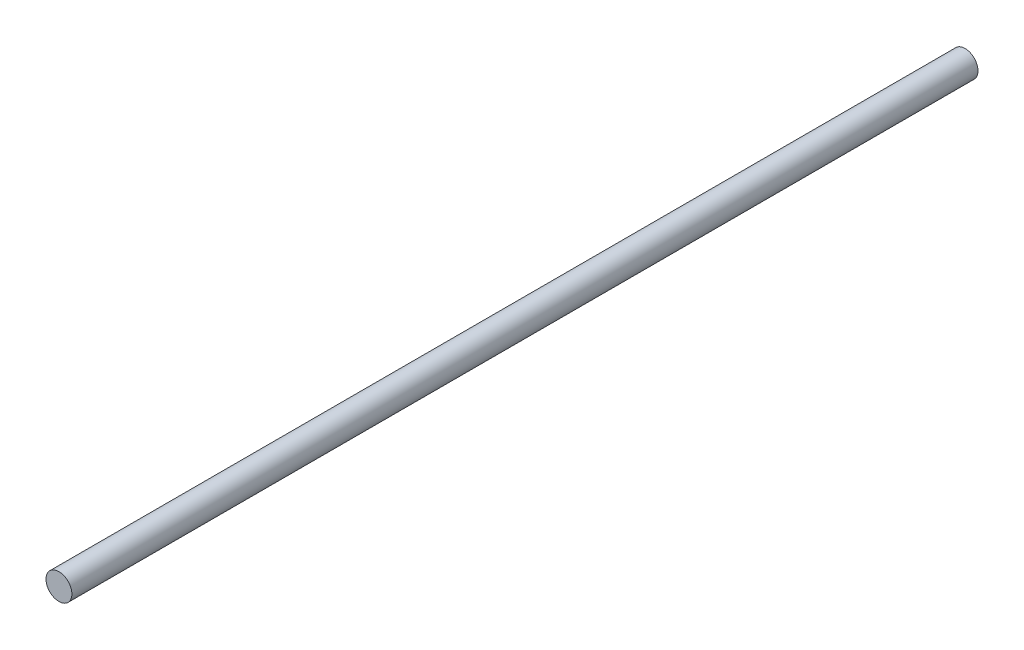
ISO-10303-21;
HEADER;
FILE_DESCRIPTION(('STEP AP214'),'2;1');
FILE_NAME('part.step','',(''),(''),'','','');
FILE_SCHEMA(('AUTOMOTIVE_DESIGN { 1 0 10303 214 1 1 1 1 }'));
ENDSEC;
DATA;
#1=APPLICATION_CONTEXT('core data for automotive mechanical design processes');
#2=APPLICATION_PROTOCOL_DEFINITION('international standard','automotive_design',2000,#1);
#3=PRODUCT_CONTEXT('',#1,'mechanical');
#4=PRODUCT('Part','Part','',(#3));
#5=PRODUCT_RELATED_PRODUCT_CATEGORY('part','',(#4));
#6=PRODUCT_DEFINITION_FORMATION('','',#4);
#7=PRODUCT_DEFINITION_CONTEXT('part definition',#1,'design');
#8=PRODUCT_DEFINITION('design','',#6,#7);
#9=PRODUCT_DEFINITION_SHAPE('','',#8);
#10=(LENGTH_UNIT() NAMED_UNIT(*) SI_UNIT(.MILLI.,.METRE.));
#11=(NAMED_UNIT(*) PLANE_ANGLE_UNIT() SI_UNIT($,.RADIAN.));
#12=(NAMED_UNIT(*) SI_UNIT($,.STERADIAN.) SOLID_ANGLE_UNIT());
#13=UNCERTAINTY_MEASURE_WITH_UNIT(LENGTH_MEASURE(1.E-05),#10,'distance_accuracy_value','');
#14=(GEOMETRIC_REPRESENTATION_CONTEXT(3) GLOBAL_UNCERTAINTY_ASSIGNED_CONTEXT((#13)) GLOBAL_UNIT_ASSIGNED_CONTEXT((#10,
#11,#12)) REPRESENTATION_CONTEXT('',''));
#15=CARTESIAN_POINT('',(0.,0.,0.));
#16=DIRECTION('',(0.,0.,1.));
#17=DIRECTION('',(1.,0.,0.));
#18=AXIS2_PLACEMENT_3D('',#15,#16,#17);
#19=CARTESIAN_POINT('',(0.,0.,560.));
#20=DIRECTION('',(0.,0.,-1.));
#21=DIRECTION('',(-1.,0.,0.));
#22=AXIS2_PLACEMENT_3D('',#19,#20,#21);
#23=CYLINDRICAL_SURFACE('',#22,8.);
#24=CARTESIAN_POINT('',(0.,0.,560.));
#25=DIRECTION('',(0.,0.,1.));
#26=DIRECTION('',(1.,0.,0.));
#27=AXIS2_PLACEMENT_3D('',#24,#25,#26);
#28=CIRCLE('',#27,8.);
#29=CARTESIAN_POINT('',(8.,0.,560.));
#30=VERTEX_POINT('',#29);
#31=EDGE_CURVE('E10',#30,#30,#28,.T.);
#32=ORIENTED_EDGE('',*,*,#31,.F.);
#33=EDGE_LOOP('',(#32));
#34=FACE_BOUND('',#33,.T.);
#35=CARTESIAN_POINT('',(0.,0.,0.));
#36=DIRECTION('',(0.,0.,1.));
#37=DIRECTION('',(1.,0.,0.));
#38=AXIS2_PLACEMENT_3D('',#35,#36,#37);
#39=CIRCLE('',#38,8.);
#40=CARTESIAN_POINT('',(8.,0.,0.));
#41=VERTEX_POINT('',#40);
#42=EDGE_CURVE('E34',#41,#41,#39,.T.);
#43=ORIENTED_EDGE('',*,*,#42,.T.);
#44=EDGE_LOOP('',(#43));
#45=FACE_BOUND('',#44,.T.);
#46=ADVANCED_FACE('F31',(#34,#45),#23,.T.);
#47=CARTESIAN_POINT('',(0.,0.,560.));
#48=DIRECTION('',(0.,0.,1.));
#49=DIRECTION('',(1.,0.,0.));
#50=AXIS2_PLACEMENT_3D('',#47,#48,#49);
#51=PLANE('',#50);
#52=ORIENTED_EDGE('',*,*,#31,.T.);
#53=EDGE_LOOP('',(#52));
#54=FACE_BOUND('',#53,.T.);
#55=ADVANCED_FACE('F46',(#54),#51,.T.);
#56=CARTESIAN_POINT('',(0.,0.,0.));
#57=DIRECTION('',(0.,0.,1.));
#58=DIRECTION('',(1.,0.,0.));
#59=AXIS2_PLACEMENT_3D('',#56,#57,#58);
#60=PLANE('',#59);
#61=ORIENTED_EDGE('',*,*,#42,.F.);
#62=EDGE_LOOP('',(#61));
#63=FACE_BOUND('',#62,.T.);
#64=ADVANCED_FACE('F44',(#63),#60,.F.);
#65=CLOSED_SHELL('',(#46,#55,#64));
#66=MANIFOLD_SOLID_BREP('B2',#65);
#67=ADVANCED_BREP_SHAPE_REPRESENTATION('',(#18,#66),#14);
#68=SHAPE_DEFINITION_REPRESENTATION(#9,#67);
ENDSEC;
END-ISO-10303-21;
